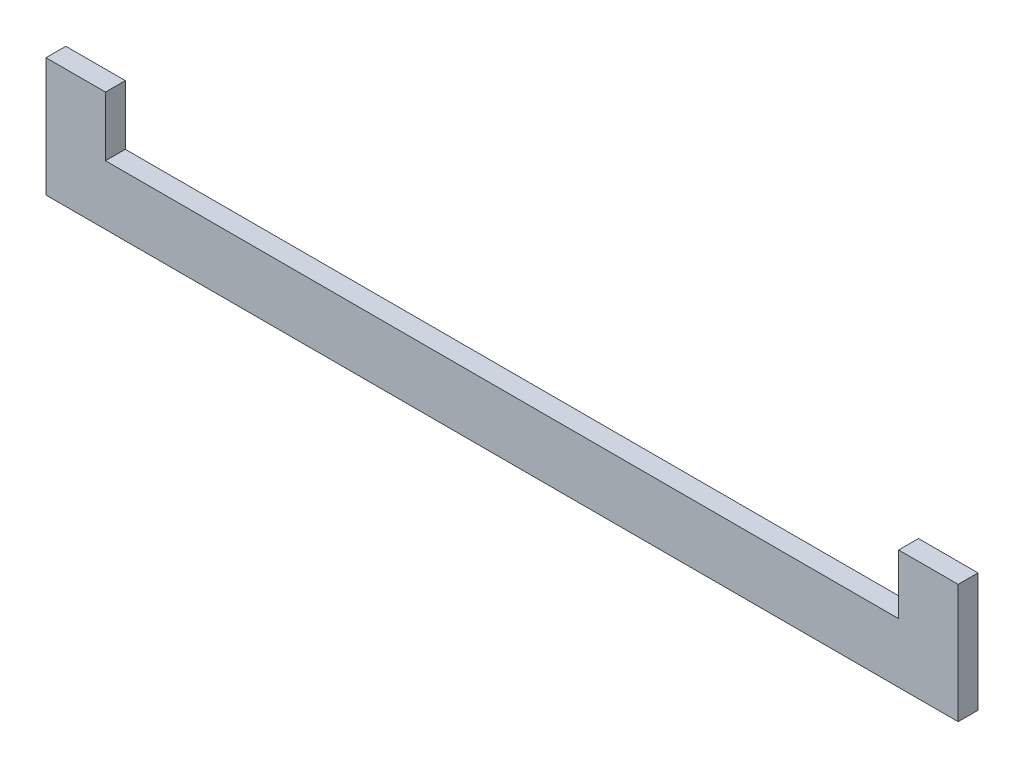
ISO-10303-21;
HEADER;
FILE_DESCRIPTION(('STEP AP214'),'2;1');
FILE_NAME('part.step','',(''),(''),'','','');
FILE_SCHEMA(('AUTOMOTIVE_DESIGN { 1 0 10303 214 1 1 1 1 }'));
ENDSEC;
DATA;
#1=APPLICATION_CONTEXT('core data for automotive mechanical design processes');
#2=APPLICATION_PROTOCOL_DEFINITION('international standard','automotive_design',2000,#1);
#3=PRODUCT_CONTEXT('',#1,'mechanical');
#4=PRODUCT('Part','Part','',(#3));
#5=PRODUCT_RELATED_PRODUCT_CATEGORY('part','',(#4));
#6=PRODUCT_DEFINITION_FORMATION('','',#4);
#7=PRODUCT_DEFINITION_CONTEXT('part definition',#1,'design');
#8=PRODUCT_DEFINITION('design','',#6,#7);
#9=PRODUCT_DEFINITION_SHAPE('','',#8);
#10=(LENGTH_UNIT() NAMED_UNIT(*) SI_UNIT(.MILLI.,.METRE.));
#11=(NAMED_UNIT(*) PLANE_ANGLE_UNIT() SI_UNIT($,.RADIAN.));
#12=(NAMED_UNIT(*) SI_UNIT($,.STERADIAN.) SOLID_ANGLE_UNIT());
#13=UNCERTAINTY_MEASURE_WITH_UNIT(LENGTH_MEASURE(1.E-05),#10,'distance_accuracy_value','');
#14=(GEOMETRIC_REPRESENTATION_CONTEXT(3) GLOBAL_UNCERTAINTY_ASSIGNED_CONTEXT((#13)) GLOBAL_UNIT_ASSIGNED_CONTEXT((#10,
#11,#12)) REPRESENTATION_CONTEXT('',''));
#15=CARTESIAN_POINT('',(0.,0.,0.));
#16=DIRECTION('',(0.,0.,1.));
#17=DIRECTION('',(1.,0.,0.));
#18=AXIS2_PLACEMENT_3D('',#15,#16,#17);
#19=CARTESIAN_POINT('',(-84.8752135589421,50.,5.));
#20=DIRECTION('',(-1.,0.,0.));
#21=DIRECTION('',(0.,0.,1.));
#22=AXIS2_PLACEMENT_3D('',#19,#20,#21);
#23=PLANE('',#22);
#24=DIRECTION('',(0.,1.,0.));
#25=VECTOR('',#24,1.);
#26=CARTESIAN_POINT('',(-84.8752135589421,50.,0.));
#27=LINE('',#26,#25);
#28=CARTESIAN_POINT('',(-84.8752135589421,50.,0.));
#29=VERTEX_POINT('',#28);
#30=CARTESIAN_POINT('',(-84.8752135589421,65.,0.));
#31=VERTEX_POINT('',#30);
#32=EDGE_CURVE('E146',#29,#31,#27,.T.);
#33=ORIENTED_EDGE('',*,*,#32,.T.);
#34=DIRECTION('',(0.,0.,-1.));
#35=VECTOR('',#34,1.);
#36=CARTESIAN_POINT('',(-84.8752135589421,65.,5.));
#37=LINE('',#36,#35);
#38=CARTESIAN_POINT('',(-84.8752135589421,65.,5.));
#39=VERTEX_POINT('',#38);
#40=EDGE_CURVE('E11',#39,#31,#37,.T.);
#41=ORIENTED_EDGE('',*,*,#40,.F.);
#42=DIRECTION('',(0.,1.,0.));
#43=VECTOR('',#42,1.);
#44=CARTESIAN_POINT('',(-84.8752135589421,50.,5.));
#45=LINE('',#44,#43);
#46=CARTESIAN_POINT('',(-84.8752135589421,50.,5.));
#47=VERTEX_POINT('',#46);
#48=EDGE_CURVE('E169',#47,#39,#45,.T.);
#49=ORIENTED_EDGE('',*,*,#48,.F.);
#50=DIRECTION('',(0.,0.,-1.));
#51=VECTOR('',#50,1.);
#52=CARTESIAN_POINT('',(-84.8752135589421,50.,5.));
#53=LINE('',#52,#51);
#54=EDGE_CURVE('E142',#47,#29,#53,.T.);
#55=ORIENTED_EDGE('',*,*,#54,.T.);
#56=EDGE_LOOP('',(#33,#41,#49,#55));
#57=FACE_BOUND('',#56,.T.);
#58=ADVANCED_FACE('F45',(#57),#23,.F.);
#59=CARTESIAN_POINT('',(-84.8752135589421,65.,5.));
#60=DIRECTION('',(0.,-1.,0.));
#61=DIRECTION('',(0.,0.,-1.));
#62=AXIS2_PLACEMENT_3D('',#59,#60,#61);
#63=PLANE('',#62);
#64=DIRECTION('',(-1.,0.,0.));
#65=VECTOR('',#64,1.);
#66=CARTESIAN_POINT('',(-84.8752135589421,65.,0.));
#67=LINE('',#66,#65);
#68=CARTESIAN_POINT('',(-99.8752135589421,65.,0.));
#69=VERTEX_POINT('',#68);
#70=EDGE_CURVE('E150',#31,#69,#67,.T.);
#71=ORIENTED_EDGE('',*,*,#70,.T.);
#72=DIRECTION('',(0.,0.,-1.));
#73=VECTOR('',#72,1.);
#74=CARTESIAN_POINT('',(-99.8752135589421,65.,5.));
#75=LINE('',#74,#73);
#76=CARTESIAN_POINT('',(-99.8752135589421,65.,5.));
#77=VERTEX_POINT('',#76);
#78=EDGE_CURVE('E54',#77,#69,#75,.T.);
#79=ORIENTED_EDGE('',*,*,#78,.F.);
#80=DIRECTION('',(-1.,0.,0.));
#81=VECTOR('',#80,1.);
#82=CARTESIAN_POINT('',(-84.8752135589421,65.,5.));
#83=LINE('',#82,#81);
#84=EDGE_CURVE('E105',#39,#77,#83,.T.);
#85=ORIENTED_EDGE('',*,*,#84,.F.);
#86=ORIENTED_EDGE('',*,*,#40,.T.);
#87=EDGE_LOOP('',(#71,#79,#85,#86));
#88=FACE_BOUND('',#87,.T.);
#89=ADVANCED_FACE('F214',(#88),#63,.F.);
#90=CARTESIAN_POINT('',(-99.8752135589421,35.,5.));
#91=DIRECTION('',(1.,0.,0.));
#92=DIRECTION('',(0.,0.,-1.));
#93=AXIS2_PLACEMENT_3D('',#90,#91,#92);
#94=PLANE('',#93);
#95=DIRECTION('',(0.,-1.,0.));
#96=VECTOR('',#95,1.);
#97=CARTESIAN_POINT('',(-99.8752135589421,35.,0.));
#98=LINE('',#97,#96);
#99=CARTESIAN_POINT('',(-99.8752135589421,35.,0.));
#100=VERTEX_POINT('',#99);
#101=EDGE_CURVE('E153',#69,#100,#98,.T.);
#102=ORIENTED_EDGE('',*,*,#101,.T.);
#103=DIRECTION('',(0.,0.,-1.));
#104=VECTOR('',#103,1.);
#105=CARTESIAN_POINT('',(-99.8752135589421,35.,5.));
#106=LINE('',#105,#104);
#107=CARTESIAN_POINT('',(-99.8752135589421,35.,5.));
#108=VERTEX_POINT('',#107);
#109=EDGE_CURVE('E180',#108,#100,#106,.T.);
#110=ORIENTED_EDGE('',*,*,#109,.F.);
#111=DIRECTION('',(0.,-1.,0.));
#112=VECTOR('',#111,1.);
#113=CARTESIAN_POINT('',(-99.8752135589421,35.,5.));
#114=LINE('',#113,#112);
#115=EDGE_CURVE('E190',#77,#108,#114,.T.);
#116=ORIENTED_EDGE('',*,*,#115,.F.);
#117=ORIENTED_EDGE('',*,*,#78,.T.);
#118=EDGE_LOOP('',(#102,#110,#116,#117));
#119=FACE_BOUND('',#118,.T.);
#120=ADVANCED_FACE('F188',(#119),#94,.F.);
#121=CARTESIAN_POINT('',(115.124786441058,35.,5.));
#122=DIRECTION('',(0.,1.,0.));
#123=DIRECTION('',(0.,0.,1.));
#124=AXIS2_PLACEMENT_3D('',#121,#122,#123);
#125=PLANE('',#124);
#126=DIRECTION('',(1.,0.,0.));
#127=VECTOR('',#126,1.);
#128=CARTESIAN_POINT('',(115.124786441058,35.,0.));
#129=LINE('',#128,#127);
#130=CARTESIAN_POINT('',(130.124786441058,35.,0.));
#131=VERTEX_POINT('',#130);
#132=EDGE_CURVE('E157',#100,#131,#129,.T.);
#133=ORIENTED_EDGE('',*,*,#132,.T.);
#134=DIRECTION('',(0.,0.,-1.));
#135=VECTOR('',#134,1.);
#136=CARTESIAN_POINT('',(130.124786441058,35.,5.));
#137=LINE('',#136,#135);
#138=CARTESIAN_POINT('',(130.124786441058,35.,5.));
#139=VERTEX_POINT('',#138);
#140=EDGE_CURVE('E176',#139,#131,#137,.T.);
#141=ORIENTED_EDGE('',*,*,#140,.F.);
#142=DIRECTION('',(1.,0.,0.));
#143=VECTOR('',#142,1.);
#144=CARTESIAN_POINT('',(-84.8752135589421,35.,5.));
#145=LINE('',#144,#143);
#146=EDGE_CURVE('E202',#108,#139,#145,.T.);
#147=ORIENTED_EDGE('',*,*,#146,.F.);
#148=ORIENTED_EDGE('',*,*,#109,.T.);
#149=EDGE_LOOP('',(#133,#141,#147,#148));
#150=FACE_BOUND('',#149,.T.);
#151=ADVANCED_FACE('F197',(#150),#125,.F.);
#152=CARTESIAN_POINT('',(130.124786441058,35.,5.));
#153=DIRECTION('',(-1.,0.,0.));
#154=DIRECTION('',(0.,0.,1.));
#155=AXIS2_PLACEMENT_3D('',#152,#153,#154);
#156=PLANE('',#155);
#157=DIRECTION('',(0.,1.,0.));
#158=VECTOR('',#157,1.);
#159=CARTESIAN_POINT('',(130.124786441058,35.,0.));
#160=LINE('',#159,#158);
#161=CARTESIAN_POINT('',(130.124786441058,65.,0.));
#162=VERTEX_POINT('',#161);
#163=EDGE_CURVE('E160',#131,#162,#160,.T.);
#164=ORIENTED_EDGE('',*,*,#163,.T.);
#165=DIRECTION('',(0.,0.,-1.));
#166=VECTOR('',#165,1.);
#167=CARTESIAN_POINT('',(130.124786441058,65.,5.));
#168=LINE('',#167,#166);
#169=CARTESIAN_POINT('',(130.124786441058,65.,5.));
#170=VERTEX_POINT('',#169);
#171=EDGE_CURVE('E135',#170,#162,#168,.T.);
#172=ORIENTED_EDGE('',*,*,#171,.F.);
#173=DIRECTION('',(0.,1.,0.));
#174=VECTOR('',#173,1.);
#175=CARTESIAN_POINT('',(130.124786441058,35.,5.));
#176=LINE('',#175,#174);
#177=EDGE_CURVE('E124',#139,#170,#176,.T.);
#178=ORIENTED_EDGE('',*,*,#177,.F.);
#179=ORIENTED_EDGE('',*,*,#140,.T.);
#180=EDGE_LOOP('',(#164,#172,#178,#179));
#181=FACE_BOUND('',#180,.T.);
#182=ADVANCED_FACE('F200',(#181),#156,.F.);
#183=CARTESIAN_POINT('',(115.124786441058,65.,5.));
#184=DIRECTION('',(0.,-1.,0.));
#185=DIRECTION('',(0.,0.,-1.));
#186=AXIS2_PLACEMENT_3D('',#183,#184,#185);
#187=PLANE('',#186);
#188=DIRECTION('',(-1.,0.,0.));
#189=VECTOR('',#188,1.);
#190=CARTESIAN_POINT('',(115.124786441058,65.,0.));
#191=LINE('',#190,#189);
#192=CARTESIAN_POINT('',(115.124786441058,65.,0.));
#193=VERTEX_POINT('',#192);
#194=EDGE_CURVE('E133',#162,#193,#191,.T.);
#195=ORIENTED_EDGE('',*,*,#194,.T.);
#196=DIRECTION('',(0.,0.,-1.));
#197=VECTOR('',#196,1.);
#198=CARTESIAN_POINT('',(115.124786441058,65.,5.));
#199=LINE('',#198,#197);
#200=CARTESIAN_POINT('',(115.124786441058,65.,5.));
#201=VERTEX_POINT('',#200);
#202=EDGE_CURVE('E130',#201,#193,#199,.T.);
#203=ORIENTED_EDGE('',*,*,#202,.F.);
#204=DIRECTION('',(-1.,0.,0.));
#205=VECTOR('',#204,1.);
#206=CARTESIAN_POINT('',(115.124786441058,65.,5.));
#207=LINE('',#206,#205);
#208=EDGE_CURVE('E118',#170,#201,#207,.T.);
#209=ORIENTED_EDGE('',*,*,#208,.F.);
#210=ORIENTED_EDGE('',*,*,#171,.T.);
#211=EDGE_LOOP('',(#195,#203,#209,#210));
#212=FACE_BOUND('',#211,.T.);
#213=ADVANCED_FACE('F131',(#212),#187,.F.);
#214=CARTESIAN_POINT('',(115.124786441058,50.,5.));
#215=DIRECTION('',(1.,0.,0.));
#216=DIRECTION('',(0.,0.,-1.));
#217=AXIS2_PLACEMENT_3D('',#214,#215,#216);
#218=PLANE('',#217);
#219=DIRECTION('',(0.,-1.,0.));
#220=VECTOR('',#219,1.);
#221=CARTESIAN_POINT('',(115.124786441058,50.,0.));
#222=LINE('',#221,#220);
#223=CARTESIAN_POINT('',(115.124786441058,50.,0.));
#224=VERTEX_POINT('',#223);
#225=EDGE_CURVE('E91',#193,#224,#222,.T.);
#226=ORIENTED_EDGE('',*,*,#225,.T.);
#227=DIRECTION('',(0.,0.,-1.));
#228=VECTOR('',#227,1.);
#229=CARTESIAN_POINT('',(115.124786441058,50.,5.));
#230=LINE('',#229,#228);
#231=CARTESIAN_POINT('',(115.124786441058,50.,5.));
#232=VERTEX_POINT('',#231);
#233=EDGE_CURVE('E136',#232,#224,#230,.T.);
#234=ORIENTED_EDGE('',*,*,#233,.F.);
#235=DIRECTION('',(0.,-1.,0.));
#236=VECTOR('',#235,1.);
#237=CARTESIAN_POINT('',(115.124786441058,50.,5.));
#238=LINE('',#237,#236);
#239=EDGE_CURVE('E122',#201,#232,#238,.T.);
#240=ORIENTED_EDGE('',*,*,#239,.F.);
#241=ORIENTED_EDGE('',*,*,#202,.T.);
#242=EDGE_LOOP('',(#226,#234,#240,#241));
#243=FACE_BOUND('',#242,.T.);
#244=ADVANCED_FACE('F138',(#243),#218,.F.);
#245=CARTESIAN_POINT('',(-84.8752135589421,50.,5.));
#246=DIRECTION('',(0.,-1.,0.));
#247=DIRECTION('',(0.,0.,-1.));
#248=AXIS2_PLACEMENT_3D('',#245,#246,#247);
#249=PLANE('',#248);
#250=DIRECTION('',(-1.,0.,0.));
#251=VECTOR('',#250,1.);
#252=CARTESIAN_POINT('',(-84.8752135589421,50.,0.));
#253=LINE('',#252,#251);
#254=EDGE_CURVE('E97',#224,#29,#253,.T.);
#255=ORIENTED_EDGE('',*,*,#254,.T.);
#256=ORIENTED_EDGE('',*,*,#54,.F.);
#257=DIRECTION('',(-1.,0.,0.));
#258=VECTOR('',#257,1.);
#259=CARTESIAN_POINT('',(-84.8752135589421,50.,5.));
#260=LINE('',#259,#258);
#261=EDGE_CURVE('E62',#232,#47,#260,.T.);
#262=ORIENTED_EDGE('',*,*,#261,.F.);
#263=ORIENTED_EDGE('',*,*,#233,.T.);
#264=EDGE_LOOP('',(#255,#256,#262,#263));
#265=FACE_BOUND('',#264,.T.);
#266=ADVANCED_FACE('F230',(#265),#249,.F.);
#267=CARTESIAN_POINT('',(0.,0.,5.));
#268=DIRECTION('',(0.,0.,1.));
#269=DIRECTION('',(1.,0.,0.));
#270=AXIS2_PLACEMENT_3D('',#267,#268,#269);
#271=PLANE('',#270);
#272=ORIENTED_EDGE('',*,*,#48,.T.);
#273=ORIENTED_EDGE('',*,*,#84,.T.);
#274=ORIENTED_EDGE('',*,*,#115,.T.);
#275=ORIENTED_EDGE('',*,*,#146,.T.);
#276=ORIENTED_EDGE('',*,*,#177,.T.);
#277=ORIENTED_EDGE('',*,*,#208,.T.);
#278=ORIENTED_EDGE('',*,*,#239,.T.);
#279=ORIENTED_EDGE('',*,*,#261,.T.);
#280=EDGE_LOOP('',(#272,#273,#274,#275,#276,#277,#278,#279));
#281=FACE_BOUND('',#280,.T.);
#282=ADVANCED_FACE('F120',(#281),#271,.T.);
#283=CARTESIAN_POINT('',(0.,0.,0.));
#284=DIRECTION('',(0.,0.,1.));
#285=DIRECTION('',(1.,0.,0.));
#286=AXIS2_PLACEMENT_3D('',#283,#284,#285);
#287=PLANE('',#286);
#288=ORIENTED_EDGE('',*,*,#32,.F.);
#289=ORIENTED_EDGE('',*,*,#254,.F.);
#290=ORIENTED_EDGE('',*,*,#225,.F.);
#291=ORIENTED_EDGE('',*,*,#194,.F.);
#292=ORIENTED_EDGE('',*,*,#163,.F.);
#293=ORIENTED_EDGE('',*,*,#132,.F.);
#294=ORIENTED_EDGE('',*,*,#101,.F.);
#295=ORIENTED_EDGE('',*,*,#70,.F.);
#296=EDGE_LOOP('',(#288,#289,#290,#291,#292,#293,#294,#295));
#297=FACE_BOUND('',#296,.T.);
#298=ADVANCED_FACE('F193',(#297),#287,.F.);
#299=CLOSED_SHELL('',(#58,#89,#120,#151,#182,#213,#244,#266,#282,#298));
#300=MANIFOLD_SOLID_BREP('B2',#299);
#301=ADVANCED_BREP_SHAPE_REPRESENTATION('',(#18,#300),#14);
#302=SHAPE_DEFINITION_REPRESENTATION(#9,#301);
ENDSEC;
END-ISO-10303-21;
